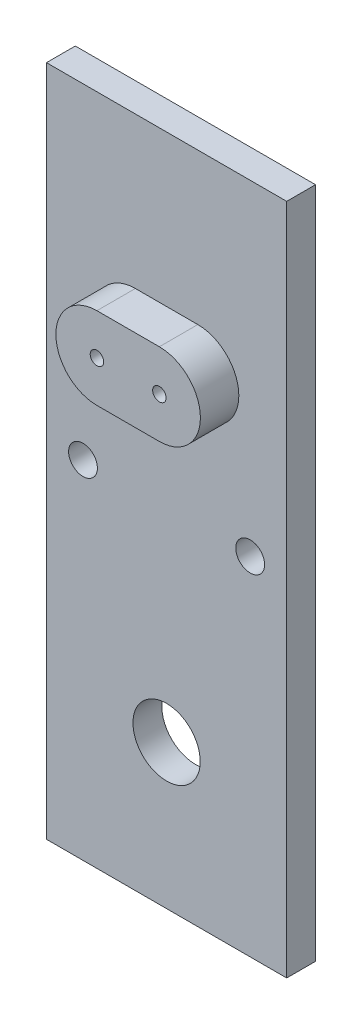
ISO-10303-21;
HEADER;
FILE_DESCRIPTION(('STEP AP214'),'2;1');
FILE_NAME('part.step','',(''),(''),'','','');
FILE_SCHEMA(('AUTOMOTIVE_DESIGN { 1 0 10303 214 1 1 1 1 }'));
ENDSEC;
DATA;
#1=APPLICATION_CONTEXT('core data for automotive mechanical design processes');
#2=APPLICATION_PROTOCOL_DEFINITION('international standard','automotive_design',2000,#1);
#3=PRODUCT_CONTEXT('',#1,'mechanical');
#4=PRODUCT('Part','Part','',(#3));
#5=PRODUCT_RELATED_PRODUCT_CATEGORY('part','',(#4));
#6=PRODUCT_DEFINITION_FORMATION('','',#4);
#7=PRODUCT_DEFINITION_CONTEXT('part definition',#1,'design');
#8=PRODUCT_DEFINITION('design','',#6,#7);
#9=PRODUCT_DEFINITION_SHAPE('','',#8);
#10=(LENGTH_UNIT() NAMED_UNIT(*) SI_UNIT(.MILLI.,.METRE.));
#11=(NAMED_UNIT(*) PLANE_ANGLE_UNIT() SI_UNIT($,.RADIAN.));
#12=(NAMED_UNIT(*) SI_UNIT($,.STERADIAN.) SOLID_ANGLE_UNIT());
#13=UNCERTAINTY_MEASURE_WITH_UNIT(LENGTH_MEASURE(1.E-05),#10,'distance_accuracy_value','');
#14=(GEOMETRIC_REPRESENTATION_CONTEXT(3) GLOBAL_UNCERTAINTY_ASSIGNED_CONTEXT((#13)) GLOBAL_UNIT_ASSIGNED_CONTEXT((#10,
#11,#12)) REPRESENTATION_CONTEXT('',''));
#15=CARTESIAN_POINT('',(0.,0.,0.));
#16=DIRECTION('',(0.,0.,1.));
#17=DIRECTION('',(1.,0.,0.));
#18=AXIS2_PLACEMENT_3D('',#15,#16,#17);
#19=CARTESIAN_POINT('',(0.,0.,3.));
#20=DIRECTION('',(0.,0.,1.));
#21=DIRECTION('',(1.,0.,0.));
#22=AXIS2_PLACEMENT_3D('',#19,#20,#21);
#23=PLANE('',#22);
#24=CARTESIAN_POINT('',(8.7,1.1,3.));
#25=DIRECTION('',(0.,0.,1.));
#26=DIRECTION('',(-1.,0.,0.));
#27=AXIS2_PLACEMENT_3D('',#24,#25,#26);
#28=CIRCLE('',#27,1.5);
#29=CARTESIAN_POINT('',(7.2,1.1,3.));
#30=VERTEX_POINT('',#29);
#31=EDGE_CURVE('E151',#30,#30,#28,.T.);
#32=ORIENTED_EDGE('',*,*,#31,.F.);
#33=EDGE_LOOP('',(#32));
#34=FACE_BOUND('',#33,.T.);
#35=CARTESIAN_POINT('',(-8.7,1.1,3.));
#36=DIRECTION('',(0.,0.,1.));
#37=DIRECTION('',(1.,0.,0.));
#38=AXIS2_PLACEMENT_3D('',#35,#36,#37);
#39=CIRCLE('',#38,1.5);
#40=CARTESIAN_POINT('',(-7.2,1.1,3.));
#41=VERTEX_POINT('',#40);
#42=EDGE_CURVE('E163',#41,#41,#39,.T.);
#43=ORIENTED_EDGE('',*,*,#42,.F.);
#44=EDGE_LOOP('',(#43));
#45=FACE_BOUND('',#44,.T.);
#46=DIRECTION('',(0.,1.,0.));
#47=VECTOR('',#46,1.);
#48=CARTESIAN_POINT('',(12.5,35.,3.));
#49=LINE('',#48,#47);
#50=CARTESIAN_POINT('',(12.5,-35.,3.));
#51=VERTEX_POINT('',#50);
#52=CARTESIAN_POINT('',(12.5,35.,3.));
#53=VERTEX_POINT('',#52);
#54=EDGE_CURVE('E169',#51,#53,#49,.T.);
#55=ORIENTED_EDGE('',*,*,#54,.T.);
#56=DIRECTION('',(-1.,0.,0.));
#57=VECTOR('',#56,1.);
#58=CARTESIAN_POINT('',(-12.5,35.,3.));
#59=LINE('',#58,#57);
#60=CARTESIAN_POINT('',(-12.5,35.,3.));
#61=VERTEX_POINT('',#60);
#62=EDGE_CURVE('E92',#53,#61,#59,.T.);
#63=ORIENTED_EDGE('',*,*,#62,.T.);
#64=DIRECTION('',(0.,-1.,0.));
#65=VECTOR('',#64,1.);
#66=CARTESIAN_POINT('',(-12.5,35.,3.));
#67=LINE('',#66,#65);
#68=CARTESIAN_POINT('',(-12.5,-35.,3.));
#69=VERTEX_POINT('',#68);
#70=EDGE_CURVE('E172',#61,#69,#67,.T.);
#71=ORIENTED_EDGE('',*,*,#70,.T.);
#72=DIRECTION('',(1.,0.,0.));
#73=VECTOR('',#72,1.);
#74=CARTESIAN_POINT('',(-12.5,-35.,3.));
#75=LINE('',#74,#73);
#76=EDGE_CURVE('E64',#69,#51,#75,.T.);
#77=ORIENTED_EDGE('',*,*,#76,.T.);
#78=EDGE_LOOP('',(#55,#63,#71,#77));
#79=FACE_BOUND('',#78,.T.);
#80=CARTESIAN_POINT('',(0.,-20.,3.));
#81=DIRECTION('',(0.,0.,1.));
#82=DIRECTION('',(1.,0.,0.));
#83=AXIS2_PLACEMENT_3D('',#80,#81,#82);
#84=CIRCLE('',#83,3.5);
#85=CARTESIAN_POINT('',(3.5,-20.,3.));
#86=VERTEX_POINT('',#85);
#87=EDGE_CURVE('E157',#86,#86,#84,.T.);
#88=ORIENTED_EDGE('',*,*,#87,.F.);
#89=EDGE_LOOP('',(#88));
#90=FACE_BOUND('',#89,.T.);
#91=DIRECTION('',(1.,0.,0.));
#92=VECTOR('',#91,1.);
#93=CARTESIAN_POINT('',(-3.25,10.7308273521799,3.));
#94=LINE('',#93,#92);
#95=CARTESIAN_POINT('',(-3.25,10.7308273521799,3.));
#96=VERTEX_POINT('',#95);
#97=CARTESIAN_POINT('',(3.25,10.7308273521799,3.));
#98=VERTEX_POINT('',#97);
#99=EDGE_CURVE('E258',#96,#98,#94,.T.);
#100=ORIENTED_EDGE('',*,*,#99,.F.);
#101=CARTESIAN_POINT('',(-3.25,15.,3.));
#102=DIRECTION('',(0.,0.,1.));
#103=DIRECTION('',(1.,0.,0.));
#104=AXIS2_PLACEMENT_3D('',#101,#102,#103);
#105=CIRCLE('',#104,4.26917264782015);
#106=CARTESIAN_POINT('',(-3.25,19.2691726478201,3.));
#107=VERTEX_POINT('',#106);
#108=EDGE_CURVE('E138',#107,#96,#105,.T.);
#109=ORIENTED_EDGE('',*,*,#108,.F.);
#110=DIRECTION('',(-1.,0.,0.));
#111=VECTOR('',#110,1.);
#112=CARTESIAN_POINT('',(-3.25,19.2691726478201,3.));
#113=LINE('',#112,#111);
#114=CARTESIAN_POINT('',(3.25,19.2691726478201,3.));
#115=VERTEX_POINT('',#114);
#116=EDGE_CURVE('E134',#115,#107,#113,.T.);
#117=ORIENTED_EDGE('',*,*,#116,.F.);
#118=CARTESIAN_POINT('',(3.25,15.,3.));
#119=DIRECTION('',(0.,0.,1.));
#120=DIRECTION('',(1.,0.,0.));
#121=AXIS2_PLACEMENT_3D('',#118,#119,#120);
#122=CIRCLE('',#121,4.26917264782015);
#123=EDGE_CURVE('E267',#98,#115,#122,.T.);
#124=ORIENTED_EDGE('',*,*,#123,.F.);
#125=EDGE_LOOP('',(#100,#109,#117,#124));
#126=FACE_BOUND('',#125,.T.);
#127=ADVANCED_FACE('F40',(#34,#45,#79,#90,#126),#23,.T.);
#128=CARTESIAN_POINT('',(0.,0.,0.));
#129=DIRECTION('',(0.,0.,1.));
#130=DIRECTION('',(1.,0.,0.));
#131=AXIS2_PLACEMENT_3D('',#128,#129,#130);
#132=PLANE('',#131);
#133=CARTESIAN_POINT('',(-3.25,15.,0.));
#134=DIRECTION('',(0.,0.,1.));
#135=DIRECTION('',(1.,0.,0.));
#136=AXIS2_PLACEMENT_3D('',#133,#134,#135);
#137=CIRCLE('',#136,0.699999999999998);
#138=CARTESIAN_POINT('',(-2.55,15.,0.));
#139=VERTEX_POINT('',#138);
#140=EDGE_CURVE('E143',#139,#139,#137,.F.);
#141=ORIENTED_EDGE('',*,*,#140,.F.);
#142=EDGE_LOOP('',(#141));
#143=FACE_BOUND('',#142,.T.);
#144=CARTESIAN_POINT('',(3.25,15.,0.));
#145=DIRECTION('',(0.,0.,1.));
#146=DIRECTION('',(1.,0.,0.));
#147=AXIS2_PLACEMENT_3D('',#144,#145,#146);
#148=CIRCLE('',#147,0.7);
#149=CARTESIAN_POINT('',(3.95,15.,0.));
#150=VERTEX_POINT('',#149);
#151=EDGE_CURVE('E140',#150,#150,#148,.F.);
#152=ORIENTED_EDGE('',*,*,#151,.F.);
#153=EDGE_LOOP('',(#152));
#154=FACE_BOUND('',#153,.T.);
#155=DIRECTION('',(0.,1.,0.));
#156=VECTOR('',#155,1.);
#157=CARTESIAN_POINT('',(12.5,35.,0.));
#158=LINE('',#157,#156);
#159=CARTESIAN_POINT('',(12.5,-35.,0.));
#160=VERTEX_POINT('',#159);
#161=CARTESIAN_POINT('',(12.5,35.,0.));
#162=VERTEX_POINT('',#161);
#163=EDGE_CURVE('E166',#160,#162,#158,.T.);
#164=ORIENTED_EDGE('',*,*,#163,.F.);
#165=DIRECTION('',(1.,0.,0.));
#166=VECTOR('',#165,1.);
#167=CARTESIAN_POINT('',(-12.5,-35.,0.));
#168=LINE('',#167,#166);
#169=CARTESIAN_POINT('',(-12.5,-35.,0.));
#170=VERTEX_POINT('',#169);
#171=EDGE_CURVE('E85',#170,#160,#168,.T.);
#172=ORIENTED_EDGE('',*,*,#171,.F.);
#173=DIRECTION('',(0.,-1.,0.));
#174=VECTOR('',#173,1.);
#175=CARTESIAN_POINT('',(-12.5,35.,0.));
#176=LINE('',#175,#174);
#177=CARTESIAN_POINT('',(-12.5,35.,0.));
#178=VERTEX_POINT('',#177);
#179=EDGE_CURVE('E180',#178,#170,#176,.T.);
#180=ORIENTED_EDGE('',*,*,#179,.F.);
#181=DIRECTION('',(-1.,0.,0.));
#182=VECTOR('',#181,1.);
#183=CARTESIAN_POINT('',(-12.5,35.,0.));
#184=LINE('',#183,#182);
#185=EDGE_CURVE('E178',#162,#178,#184,.T.);
#186=ORIENTED_EDGE('',*,*,#185,.F.);
#187=EDGE_LOOP('',(#164,#172,#180,#186));
#188=FACE_BOUND('',#187,.T.);
#189=CARTESIAN_POINT('',(-8.7,1.1,0.));
#190=DIRECTION('',(0.,0.,1.));
#191=DIRECTION('',(1.,0.,0.));
#192=AXIS2_PLACEMENT_3D('',#189,#190,#191);
#193=CIRCLE('',#192,1.5);
#194=CARTESIAN_POINT('',(-7.2,1.1,0.));
#195=VERTEX_POINT('',#194);
#196=EDGE_CURVE('E160',#195,#195,#193,.T.);
#197=ORIENTED_EDGE('',*,*,#196,.T.);
#198=EDGE_LOOP('',(#197));
#199=FACE_BOUND('',#198,.T.);
#200=CARTESIAN_POINT('',(0.,-20.,0.));
#201=DIRECTION('',(0.,0.,1.));
#202=DIRECTION('',(1.,0.,0.));
#203=AXIS2_PLACEMENT_3D('',#200,#201,#202);
#204=CIRCLE('',#203,3.5);
#205=CARTESIAN_POINT('',(3.5,-20.,0.));
#206=VERTEX_POINT('',#205);
#207=EDGE_CURVE('E154',#206,#206,#204,.T.);
#208=ORIENTED_EDGE('',*,*,#207,.T.);
#209=EDGE_LOOP('',(#208));
#210=FACE_BOUND('',#209,.T.);
#211=CARTESIAN_POINT('',(8.7,1.1,0.));
#212=DIRECTION('',(0.,0.,1.));
#213=DIRECTION('',(-1.,0.,0.));
#214=AXIS2_PLACEMENT_3D('',#211,#212,#213);
#215=CIRCLE('',#214,1.5);
#216=CARTESIAN_POINT('',(7.2,1.1,0.));
#217=VERTEX_POINT('',#216);
#218=EDGE_CURVE('E149',#217,#217,#215,.T.);
#219=ORIENTED_EDGE('',*,*,#218,.T.);
#220=EDGE_LOOP('',(#219));
#221=FACE_BOUND('',#220,.T.);
#222=ADVANCED_FACE('F193',(#143,#154,#188,#199,#210,#221),#132,.F.);
#223=CARTESIAN_POINT('',(12.5,35.,3.));
#224=DIRECTION('',(-1.,0.,0.));
#225=DIRECTION('',(0.,-1.,0.));
#226=AXIS2_PLACEMENT_3D('',#223,#224,#225);
#227=PLANE('',#226);
#228=ORIENTED_EDGE('',*,*,#163,.T.);
#229=DIRECTION('',(0.,0.,-1.));
#230=VECTOR('',#229,1.);
#231=CARTESIAN_POINT('',(12.5,35.,3.));
#232=LINE('',#231,#230);
#233=EDGE_CURVE('E11',#53,#162,#232,.T.);
#234=ORIENTED_EDGE('',*,*,#233,.F.);
#235=ORIENTED_EDGE('',*,*,#54,.F.);
#236=DIRECTION('',(0.,0.,-1.));
#237=VECTOR('',#236,1.);
#238=CARTESIAN_POINT('',(12.5,-35.,3.));
#239=LINE('',#238,#237);
#240=EDGE_CURVE('E175',#51,#160,#239,.T.);
#241=ORIENTED_EDGE('',*,*,#240,.T.);
#242=EDGE_LOOP('',(#228,#234,#235,#241));
#243=FACE_BOUND('',#242,.T.);
#244=ADVANCED_FACE('F42',(#243),#227,.F.);
#245=CARTESIAN_POINT('',(-12.5,35.,3.));
#246=DIRECTION('',(0.,-1.,0.));
#247=DIRECTION('',(0.,0.,-1.));
#248=AXIS2_PLACEMENT_3D('',#245,#246,#247);
#249=PLANE('',#248);
#250=ORIENTED_EDGE('',*,*,#185,.T.);
#251=DIRECTION('',(0.,0.,-1.));
#252=VECTOR('',#251,1.);
#253=CARTESIAN_POINT('',(-12.5,35.,3.));
#254=LINE('',#253,#252);
#255=EDGE_CURVE('E48',#61,#178,#254,.T.);
#256=ORIENTED_EDGE('',*,*,#255,.F.);
#257=ORIENTED_EDGE('',*,*,#62,.F.);
#258=ORIENTED_EDGE('',*,*,#233,.T.);
#259=EDGE_LOOP('',(#250,#256,#257,#258));
#260=FACE_BOUND('',#259,.T.);
#261=ADVANCED_FACE('F209',(#260),#249,.F.);
#262=CARTESIAN_POINT('',(-12.5,35.,3.));
#263=DIRECTION('',(1.,0.,0.));
#264=DIRECTION('',(0.,1.,0.));
#265=AXIS2_PLACEMENT_3D('',#262,#263,#264);
#266=PLANE('',#265);
#267=ORIENTED_EDGE('',*,*,#179,.T.);
#268=DIRECTION('',(0.,0.,-1.));
#269=VECTOR('',#268,1.);
#270=CARTESIAN_POINT('',(-12.5,-35.,3.));
#271=LINE('',#270,#269);
#272=EDGE_CURVE('E184',#69,#170,#271,.T.);
#273=ORIENTED_EDGE('',*,*,#272,.F.);
#274=ORIENTED_EDGE('',*,*,#70,.F.);
#275=ORIENTED_EDGE('',*,*,#255,.T.);
#276=EDGE_LOOP('',(#267,#273,#274,#275));
#277=FACE_BOUND('',#276,.T.);
#278=ADVANCED_FACE('F189',(#277),#266,.F.);
#279=CARTESIAN_POINT('',(-12.5,-35.,3.));
#280=DIRECTION('',(0.,1.,0.));
#281=DIRECTION('',(0.,0.,1.));
#282=AXIS2_PLACEMENT_3D('',#279,#280,#281);
#283=PLANE('',#282);
#284=ORIENTED_EDGE('',*,*,#171,.T.);
#285=ORIENTED_EDGE('',*,*,#240,.F.);
#286=ORIENTED_EDGE('',*,*,#76,.F.);
#287=ORIENTED_EDGE('',*,*,#272,.T.);
#288=EDGE_LOOP('',(#284,#285,#286,#287));
#289=FACE_BOUND('',#288,.T.);
#290=ADVANCED_FACE('F198',(#289),#283,.F.);
#291=CARTESIAN_POINT('',(-8.7,1.1,3.));
#292=DIRECTION('',(0.,0.,-1.));
#293=DIRECTION('',(-1.,0.,0.));
#294=AXIS2_PLACEMENT_3D('',#291,#292,#293);
#295=CYLINDRICAL_SURFACE('',#294,1.5);
#296=ORIENTED_EDGE('',*,*,#42,.T.);
#297=EDGE_LOOP('',(#296));
#298=FACE_BOUND('',#297,.T.);
#299=ORIENTED_EDGE('',*,*,#196,.F.);
#300=EDGE_LOOP('',(#299));
#301=FACE_BOUND('',#300,.T.);
#302=ADVANCED_FACE('F200',(#298,#301),#295,.F.);
#303=CARTESIAN_POINT('',(0.,-20.,3.));
#304=DIRECTION('',(0.,0.,-1.));
#305=DIRECTION('',(-1.,0.,0.));
#306=AXIS2_PLACEMENT_3D('',#303,#304,#305);
#307=CYLINDRICAL_SURFACE('',#306,3.5);
#308=ORIENTED_EDGE('',*,*,#87,.T.);
#309=EDGE_LOOP('',(#308));
#310=FACE_BOUND('',#309,.T.);
#311=ORIENTED_EDGE('',*,*,#207,.F.);
#312=EDGE_LOOP('',(#311));
#313=FACE_BOUND('',#312,.T.);
#314=ADVANCED_FACE('F206',(#310,#313),#307,.F.);
#315=CARTESIAN_POINT('',(8.7,1.1,3.));
#316=DIRECTION('',(0.,0.,-1.));
#317=DIRECTION('',(-1.,0.,0.));
#318=AXIS2_PLACEMENT_3D('',#315,#316,#317);
#319=CYLINDRICAL_SURFACE('',#318,1.5);
#320=ORIENTED_EDGE('',*,*,#31,.T.);
#321=EDGE_LOOP('',(#320));
#322=FACE_BOUND('',#321,.T.);
#323=ORIENTED_EDGE('',*,*,#218,.F.);
#324=EDGE_LOOP('',(#323));
#325=FACE_BOUND('',#324,.T.);
#326=ADVANCED_FACE('F224',(#322,#325),#319,.F.);
#327=CARTESIAN_POINT('',(3.25,15.,-0.00100000000000013));
#328=DIRECTION('',(0.,0.,1.));
#329=DIRECTION('',(1.,0.,0.));
#330=AXIS2_PLACEMENT_3D('',#327,#328,#329);
#331=CYLINDRICAL_SURFACE('',#330,0.7);
#332=CARTESIAN_POINT('',(3.25,15.,7.));
#333=DIRECTION('',(0.,0.,1.));
#334=DIRECTION('',(1.,0.,0.));
#335=AXIS2_PLACEMENT_3D('',#332,#333,#334);
#336=CIRCLE('',#335,0.699999999999998);
#337=CARTESIAN_POINT('',(3.95,15.,7.));
#338=VERTEX_POINT('',#337);
#339=EDGE_CURVE('E256',#338,#338,#336,.T.);
#340=CARTESIAN_POINT('',(3.95,15.,0.));
#341=CARTESIAN_POINT('',(3.95,15.,0.0729166666666665));
#342=CARTESIAN_POINT('',(3.95,15.,0.145833333333333));
#343=CARTESIAN_POINT('',(3.95,15.,0.291666666666667));
#344=CARTESIAN_POINT('',(3.95,15.,0.364583333333333));
#345=CARTESIAN_POINT('',(3.95,15.,0.510416666666667));
#346=CARTESIAN_POINT('',(3.95,15.,0.583333333333333));
#347=CARTESIAN_POINT('',(3.95,15.,0.729166666666667));
#348=CARTESIAN_POINT('',(3.95,15.,0.802083333333333));
#349=CARTESIAN_POINT('',(3.95,15.,0.947916666666667));
#350=CARTESIAN_POINT('',(3.95,15.,1.02083333333333));
#351=CARTESIAN_POINT('',(3.95,15.,1.16666666666667));
#352=CARTESIAN_POINT('',(3.95,15.,1.23958333333333));
#353=CARTESIAN_POINT('',(3.95,15.,1.38541666666667));
#354=CARTESIAN_POINT('',(3.95,15.,1.45833333333333));
#355=CARTESIAN_POINT('',(3.95,15.,1.60416666666667));
#356=CARTESIAN_POINT('',(3.95,15.,1.67708333333333));
#357=CARTESIAN_POINT('',(3.95,15.,1.82291666666667));
#358=CARTESIAN_POINT('',(3.95,15.,1.89583333333333));
#359=CARTESIAN_POINT('',(3.95,15.,2.04166666666667));
#360=CARTESIAN_POINT('',(3.95,15.,2.11458333333333));
#361=CARTESIAN_POINT('',(3.95,15.,2.26041666666667));
#362=CARTESIAN_POINT('',(3.95,15.,2.33333333333333));
#363=CARTESIAN_POINT('',(3.95,15.,2.47916666666667));
#364=CARTESIAN_POINT('',(3.95,15.,2.55208333333333));
#365=CARTESIAN_POINT('',(3.95,15.,2.69791666666667));
#366=CARTESIAN_POINT('',(3.95,15.,2.77083333333333));
#367=CARTESIAN_POINT('',(3.95,15.,2.91666666666667));
#368=CARTESIAN_POINT('',(3.95,15.,2.98958333333333));
#369=CARTESIAN_POINT('',(3.95,15.,3.13541666666667));
#370=CARTESIAN_POINT('',(3.95,15.,3.20833333333333));
#371=CARTESIAN_POINT('',(3.95,15.,3.35416666666667));
#372=CARTESIAN_POINT('',(3.95,15.,3.42708333333333));
#373=CARTESIAN_POINT('',(3.95,15.,3.57291666666667));
#374=CARTESIAN_POINT('',(3.95,15.,3.64583333333333));
#375=CARTESIAN_POINT('',(3.95,15.,3.79166666666667));
#376=CARTESIAN_POINT('',(3.95,15.,3.86458333333333));
#377=CARTESIAN_POINT('',(3.95,15.,4.01041666666667));
#378=CARTESIAN_POINT('',(3.95,15.,4.08333333333333));
#379=CARTESIAN_POINT('',(3.95,15.,4.22916666666667));
#380=CARTESIAN_POINT('',(3.95,15.,4.30208333333333));
#381=CARTESIAN_POINT('',(3.95,15.,4.44791666666667));
#382=CARTESIAN_POINT('',(3.95,15.,4.52083333333333));
#383=CARTESIAN_POINT('',(3.95,15.,4.66666666666667));
#384=CARTESIAN_POINT('',(3.95,15.,4.73958333333333));
#385=CARTESIAN_POINT('',(3.95,15.,4.88541666666667));
#386=CARTESIAN_POINT('',(3.95,15.,4.95833333333333));
#387=CARTESIAN_POINT('',(3.95,15.,5.10416666666667));
#388=CARTESIAN_POINT('',(3.95,15.,5.17708333333333));
#389=CARTESIAN_POINT('',(3.95,15.,5.32291666666667));
#390=CARTESIAN_POINT('',(3.95,15.,5.39583333333333));
#391=CARTESIAN_POINT('',(3.95,15.,5.54166666666667));
#392=CARTESIAN_POINT('',(3.95,15.,5.61458333333333));
#393=CARTESIAN_POINT('',(3.95,15.,5.76041666666667));
#394=CARTESIAN_POINT('',(3.95,15.,5.83333333333333));
#395=CARTESIAN_POINT('',(3.95,15.,5.97916666666667));
#396=CARTESIAN_POINT('',(3.95,15.,6.05208333333333));
#397=CARTESIAN_POINT('',(3.95,15.,6.19791666666667));
#398=CARTESIAN_POINT('',(3.95,15.,6.27083333333333));
#399=CARTESIAN_POINT('',(3.95,15.,6.41666666666667));
#400=CARTESIAN_POINT('',(3.95,15.,6.48958333333333));
#401=CARTESIAN_POINT('',(3.95,15.,6.63541666666667));
#402=CARTESIAN_POINT('',(3.95,15.,6.70833333333333));
#403=CARTESIAN_POINT('',(3.95,15.,6.85416666666667));
#404=CARTESIAN_POINT('',(3.95,15.,6.92708333333333));
#405=CARTESIAN_POINT('',(3.95,15.,7.));
#406=B_SPLINE_CURVE_WITH_KNOTS('',3,(#340,#341,#342,#343,#344,#345,#346,#347,#348,#349,#350,
#351,#352,#353,#354,#355,#356,#357,#358,#359,#360,#361,#362,#363,#364,#365,#366,#367,#368,#369,
#370,#371,#372,#373,#374,#375,#376,#377,#378,#379,#380,#381,#382,#383,#384,#385,#386,#387,#388,
#389,#390,#391,#392,#393,#394,#395,#396,#397,#398,#399,#400,#401,#402,#403,#404,#405),
.UNSPECIFIED.,.F.,.F.,(4,2,2,2,2,2,2,2,2,2,2,2,2,2,2,2,2,2,2,2,2,2,2,2,2,2,2,2,2,2,2,2,4),(0.,
0.21875,0.4375,0.65625,0.875,1.09375,1.3125,1.53125,1.75,1.96875,2.1875,2.40625,2.625,2.84375,
3.0625,3.28125,3.5,3.71875,3.9375,4.15625,4.375,4.59375,4.8125,5.03125,5.25,5.46875,5.6875,
5.90625,6.125,6.34375,6.5625,6.78125,7.),.UNSPECIFIED.);
#407=EDGE_CURVE('BSEAM228',#150,#338,#406,.T.);
#408=ORIENTED_EDGE('',*,*,#151,.T.);
#409=ORIENTED_EDGE('',*,*,#339,.T.);
#410=ORIENTED_EDGE('',*,*,#407,.T.);
#411=ORIENTED_EDGE('',*,*,#407,.F.);
#412=EDGE_LOOP('',(#408,#410,#409,#411));
#413=FACE_BOUND('',#412,.T.);
#414=ADVANCED_FACE('F228',(#413),#331,.F.);
#415=CARTESIAN_POINT('',(-3.25,15.,-0.00100000000000013));
#416=DIRECTION('',(0.,0.,1.));
#417=DIRECTION('',(1.,0.,0.));
#418=AXIS2_PLACEMENT_3D('',#415,#416,#417);
#419=CYLINDRICAL_SURFACE('',#418,0.699999999999998);
#420=CARTESIAN_POINT('',(-3.25,15.,7.));
#421=DIRECTION('',(0.,0.,1.));
#422=DIRECTION('',(1.,0.,0.));
#423=AXIS2_PLACEMENT_3D('',#420,#421,#422);
#424=CIRCLE('',#423,0.699999999999998);
#425=CARTESIAN_POINT('',(-2.55,15.,7.));
#426=VERTEX_POINT('',#425);
#427=EDGE_CURVE('E254',#426,#426,#424,.T.);
#428=CARTESIAN_POINT('',(-2.55,15.,0.));
#429=CARTESIAN_POINT('',(-2.55,15.,0.0729166666666665));
#430=CARTESIAN_POINT('',(-2.55,15.,0.145833333333333));
#431=CARTESIAN_POINT('',(-2.55,15.,0.291666666666667));
#432=CARTESIAN_POINT('',(-2.55,15.,0.364583333333333));
#433=CARTESIAN_POINT('',(-2.55,15.,0.510416666666667));
#434=CARTESIAN_POINT('',(-2.55,15.,0.583333333333333));
#435=CARTESIAN_POINT('',(-2.55,15.,0.729166666666667));
#436=CARTESIAN_POINT('',(-2.55,15.,0.802083333333333));
#437=CARTESIAN_POINT('',(-2.55,15.,0.947916666666667));
#438=CARTESIAN_POINT('',(-2.55,15.,1.02083333333333));
#439=CARTESIAN_POINT('',(-2.55,15.,1.16666666666667));
#440=CARTESIAN_POINT('',(-2.55,15.,1.23958333333333));
#441=CARTESIAN_POINT('',(-2.55,15.,1.38541666666667));
#442=CARTESIAN_POINT('',(-2.55,15.,1.45833333333333));
#443=CARTESIAN_POINT('',(-2.55,15.,1.60416666666667));
#444=CARTESIAN_POINT('',(-2.55,15.,1.67708333333333));
#445=CARTESIAN_POINT('',(-2.55,15.,1.82291666666667));
#446=CARTESIAN_POINT('',(-2.55,15.,1.89583333333333));
#447=CARTESIAN_POINT('',(-2.55,15.,2.04166666666667));
#448=CARTESIAN_POINT('',(-2.55,15.,2.11458333333333));
#449=CARTESIAN_POINT('',(-2.55,15.,2.26041666666667));
#450=CARTESIAN_POINT('',(-2.55,15.,2.33333333333333));
#451=CARTESIAN_POINT('',(-2.55,15.,2.47916666666667));
#452=CARTESIAN_POINT('',(-2.55,15.,2.55208333333333));
#453=CARTESIAN_POINT('',(-2.55,15.,2.69791666666667));
#454=CARTESIAN_POINT('',(-2.55,15.,2.77083333333333));
#455=CARTESIAN_POINT('',(-2.55,15.,2.91666666666667));
#456=CARTESIAN_POINT('',(-2.55,15.,2.98958333333333));
#457=CARTESIAN_POINT('',(-2.55,15.,3.13541666666667));
#458=CARTESIAN_POINT('',(-2.55,15.,3.20833333333333));
#459=CARTESIAN_POINT('',(-2.55,15.,3.35416666666667));
#460=CARTESIAN_POINT('',(-2.55,15.,3.42708333333333));
#461=CARTESIAN_POINT('',(-2.55,15.,3.57291666666667));
#462=CARTESIAN_POINT('',(-2.55,15.,3.64583333333333));
#463=CARTESIAN_POINT('',(-2.55,15.,3.79166666666667));
#464=CARTESIAN_POINT('',(-2.55,15.,3.86458333333333));
#465=CARTESIAN_POINT('',(-2.55,15.,4.01041666666667));
#466=CARTESIAN_POINT('',(-2.55,15.,4.08333333333333));
#467=CARTESIAN_POINT('',(-2.55,15.,4.22916666666667));
#468=CARTESIAN_POINT('',(-2.55,15.,4.30208333333333));
#469=CARTESIAN_POINT('',(-2.55,15.,4.44791666666667));
#470=CARTESIAN_POINT('',(-2.55,15.,4.52083333333333));
#471=CARTESIAN_POINT('',(-2.55,15.,4.66666666666667));
#472=CARTESIAN_POINT('',(-2.55,15.,4.73958333333333));
#473=CARTESIAN_POINT('',(-2.55,15.,4.88541666666667));
#474=CARTESIAN_POINT('',(-2.55,15.,4.95833333333333));
#475=CARTESIAN_POINT('',(-2.55,15.,5.10416666666667));
#476=CARTESIAN_POINT('',(-2.55,15.,5.17708333333333));
#477=CARTESIAN_POINT('',(-2.55,15.,5.32291666666667));
#478=CARTESIAN_POINT('',(-2.55,15.,5.39583333333333));
#479=CARTESIAN_POINT('',(-2.55,15.,5.54166666666667));
#480=CARTESIAN_POINT('',(-2.55,15.,5.61458333333333));
#481=CARTESIAN_POINT('',(-2.55,15.,5.76041666666667));
#482=CARTESIAN_POINT('',(-2.55,15.,5.83333333333333));
#483=CARTESIAN_POINT('',(-2.55,15.,5.97916666666667));
#484=CARTESIAN_POINT('',(-2.55,15.,6.05208333333333));
#485=CARTESIAN_POINT('',(-2.55,15.,6.19791666666667));
#486=CARTESIAN_POINT('',(-2.55,15.,6.27083333333333));
#487=CARTESIAN_POINT('',(-2.55,15.,6.41666666666667));
#488=CARTESIAN_POINT('',(-2.55,15.,6.48958333333333));
#489=CARTESIAN_POINT('',(-2.55,15.,6.63541666666667));
#490=CARTESIAN_POINT('',(-2.55,15.,6.70833333333333));
#491=CARTESIAN_POINT('',(-2.55,15.,6.85416666666667));
#492=CARTESIAN_POINT('',(-2.55,15.,6.92708333333333));
#493=CARTESIAN_POINT('',(-2.55,15.,7.));
#494=B_SPLINE_CURVE_WITH_KNOTS('',3,(#428,#429,#430,#431,#432,#433,#434,#435,#436,#437,#438,
#439,#440,#441,#442,#443,#444,#445,#446,#447,#448,#449,#450,#451,#452,#453,#454,#455,#456,#457,
#458,#459,#460,#461,#462,#463,#464,#465,#466,#467,#468,#469,#470,#471,#472,#473,#474,#475,#476,
#477,#478,#479,#480,#481,#482,#483,#484,#485,#486,#487,#488,#489,#490,#491,#492,#493),
.UNSPECIFIED.,.F.,.F.,(4,2,2,2,2,2,2,2,2,2,2,2,2,2,2,2,2,2,2,2,2,2,2,2,2,2,2,2,2,2,2,2,4),(0.,
0.21875,0.4375,0.65625,0.875,1.09375,1.3125,1.53125,1.75,1.96875,2.1875,2.40625,2.625,2.84375,
3.0625,3.28125,3.5,3.71875,3.9375,4.15625,4.375,4.59375,4.8125,5.03125,5.25,5.46875,5.6875,
5.90625,6.125,6.34375,6.5625,6.78125,7.),.UNSPECIFIED.);
#495=EDGE_CURVE('BSEAM232',#139,#426,#494,.T.);
#496=ORIENTED_EDGE('',*,*,#140,.T.);
#497=ORIENTED_EDGE('',*,*,#427,.T.);
#498=ORIENTED_EDGE('',*,*,#495,.T.);
#499=ORIENTED_EDGE('',*,*,#495,.F.);
#500=EDGE_LOOP('',(#496,#498,#497,#499));
#501=FACE_BOUND('',#500,.T.);
#502=ADVANCED_FACE('F232',(#501),#419,.F.);
#503=CARTESIAN_POINT('',(-3.25,15.,7.));
#504=DIRECTION('',(0.,0.,1.));
#505=DIRECTION('',(1.,0.,0.));
#506=AXIS2_PLACEMENT_3D('',#503,#504,#505);
#507=PLANE('',#506);
#508=ORIENTED_EDGE('',*,*,#427,.F.);
#509=EDGE_LOOP('',(#508));
#510=FACE_BOUND('',#509,.T.);
#511=CARTESIAN_POINT('',(-3.25,15.,7.));
#512=DIRECTION('',(0.,0.,1.));
#513=DIRECTION('',(1.,0.,0.));
#514=AXIS2_PLACEMENT_3D('',#511,#512,#513);
#515=CIRCLE('',#514,4.26917264782015);
#516=CARTESIAN_POINT('',(-3.25,19.2691726478201,7.));
#517=VERTEX_POINT('',#516);
#518=CARTESIAN_POINT('',(-3.25,10.7308273521799,7.));
#519=VERTEX_POINT('',#518);
#520=EDGE_CURVE('E125',#517,#519,#515,.T.);
#521=ORIENTED_EDGE('',*,*,#520,.T.);
#522=DIRECTION('',(1.,0.,0.));
#523=VECTOR('',#522,1.);
#524=CARTESIAN_POINT('',(-3.25,10.7308273521799,7.));
#525=LINE('',#524,#523);
#526=CARTESIAN_POINT('',(3.25,10.7308273521799,7.));
#527=VERTEX_POINT('',#526);
#528=EDGE_CURVE('E114',#519,#527,#525,.T.);
#529=ORIENTED_EDGE('',*,*,#528,.T.);
#530=CARTESIAN_POINT('',(3.25,15.,7.));
#531=DIRECTION('',(0.,0.,1.));
#532=DIRECTION('',(1.,0.,0.));
#533=AXIS2_PLACEMENT_3D('',#530,#531,#532);
#534=CIRCLE('',#533,4.26917264782015);
#535=CARTESIAN_POINT('',(3.25,19.2691726478201,7.));
#536=VERTEX_POINT('',#535);
#537=EDGE_CURVE('E124',#527,#536,#534,.T.);
#538=ORIENTED_EDGE('',*,*,#537,.T.);
#539=DIRECTION('',(-1.,0.,0.));
#540=VECTOR('',#539,1.);
#541=CARTESIAN_POINT('',(-3.25,19.2691726478201,7.));
#542=LINE('',#541,#540);
#543=EDGE_CURVE('E130',#536,#517,#542,.T.);
#544=ORIENTED_EDGE('',*,*,#543,.T.);
#545=EDGE_LOOP('',(#521,#529,#538,#544));
#546=FACE_BOUND('',#545,.T.);
#547=ORIENTED_EDGE('',*,*,#339,.F.);
#548=EDGE_LOOP('',(#547));
#549=FACE_BOUND('',#548,.T.);
#550=ADVANCED_FACE('F128',(#510,#546,#549),#507,.T.);
#551=CARTESIAN_POINT('',(-3.25,15.,7.));
#552=DIRECTION('',(0.,0.,-1.));
#553=DIRECTION('',(-1.,0.,0.));
#554=AXIS2_PLACEMENT_3D('',#551,#552,#553);
#555=CYLINDRICAL_SURFACE('',#554,4.26917264782015);
#556=ORIENTED_EDGE('',*,*,#108,.T.);
#557=DIRECTION('',(0.,0.,-1.));
#558=VECTOR('',#557,1.);
#559=CARTESIAN_POINT('',(-3.25,10.7308273521799,7.));
#560=LINE('',#559,#558);
#561=EDGE_CURVE('E118',#519,#96,#560,.T.);
#562=ORIENTED_EDGE('',*,*,#561,.F.);
#563=ORIENTED_EDGE('',*,*,#520,.F.);
#564=DIRECTION('',(0.,0.,-1.));
#565=VECTOR('',#564,1.);
#566=CARTESIAN_POINT('',(-3.25,19.2691726478201,7.));
#567=LINE('',#566,#565);
#568=EDGE_CURVE('E264',#517,#107,#567,.T.);
#569=ORIENTED_EDGE('',*,*,#568,.T.);
#570=EDGE_LOOP('',(#556,#562,#563,#569));
#571=FACE_BOUND('',#570,.T.);
#572=ADVANCED_FACE('F136',(#571),#555,.T.);
#573=CARTESIAN_POINT('',(-3.25,10.7308273521799,7.));
#574=DIRECTION('',(0.,1.,0.));
#575=DIRECTION('',(0.,0.,1.));
#576=AXIS2_PLACEMENT_3D('',#573,#574,#575);
#577=PLANE('',#576);
#578=ORIENTED_EDGE('',*,*,#99,.T.);
#579=DIRECTION('',(0.,0.,-1.));
#580=VECTOR('',#579,1.);
#581=CARTESIAN_POINT('',(3.25,10.7308273521799,7.));
#582=LINE('',#581,#580);
#583=EDGE_CURVE('E121',#527,#98,#582,.T.);
#584=ORIENTED_EDGE('',*,*,#583,.F.);
#585=ORIENTED_EDGE('',*,*,#528,.F.);
#586=ORIENTED_EDGE('',*,*,#561,.T.);
#587=EDGE_LOOP('',(#578,#584,#585,#586));
#588=FACE_BOUND('',#587,.T.);
#589=ADVANCED_FACE('F116',(#588),#577,.F.);
#590=CARTESIAN_POINT('',(3.25,15.,7.));
#591=DIRECTION('',(0.,0.,-1.));
#592=DIRECTION('',(-1.,0.,0.));
#593=AXIS2_PLACEMENT_3D('',#590,#591,#592);
#594=CYLINDRICAL_SURFACE('',#593,4.26917264782015);
#595=ORIENTED_EDGE('',*,*,#123,.T.);
#596=DIRECTION('',(0.,0.,-1.));
#597=VECTOR('',#596,1.);
#598=CARTESIAN_POINT('',(3.25,19.2691726478201,7.));
#599=LINE('',#598,#597);
#600=EDGE_CURVE('E55',#536,#115,#599,.T.);
#601=ORIENTED_EDGE('',*,*,#600,.F.);
#602=ORIENTED_EDGE('',*,*,#537,.F.);
#603=ORIENTED_EDGE('',*,*,#583,.T.);
#604=EDGE_LOOP('',(#595,#601,#602,#603));
#605=FACE_BOUND('',#604,.T.);
#606=ADVANCED_FACE('F241',(#605),#594,.T.);
#607=CARTESIAN_POINT('',(-3.25,19.2691726478201,7.));
#608=DIRECTION('',(0.,-1.,0.));
#609=DIRECTION('',(0.,0.,-1.));
#610=AXIS2_PLACEMENT_3D('',#607,#608,#609);
#611=PLANE('',#610);
#612=ORIENTED_EDGE('',*,*,#116,.T.);
#613=ORIENTED_EDGE('',*,*,#568,.F.);
#614=ORIENTED_EDGE('',*,*,#543,.F.);
#615=ORIENTED_EDGE('',*,*,#600,.T.);
#616=EDGE_LOOP('',(#612,#613,#614,#615));
#617=FACE_BOUND('',#616,.T.);
#618=ADVANCED_FACE('F244',(#617),#611,.F.);
#619=CLOSED_SHELL('',(#127,#222,#244,#261,#278,#290,#302,#314,#326,#414,#502,#550,#572,#589,
#606,#618));
#620=MANIFOLD_SOLID_BREP('B2',#619);
#621=ADVANCED_BREP_SHAPE_REPRESENTATION('',(#18,#620),#14);
#622=SHAPE_DEFINITION_REPRESENTATION(#9,#621);
ENDSEC;
END-ISO-10303-21;
